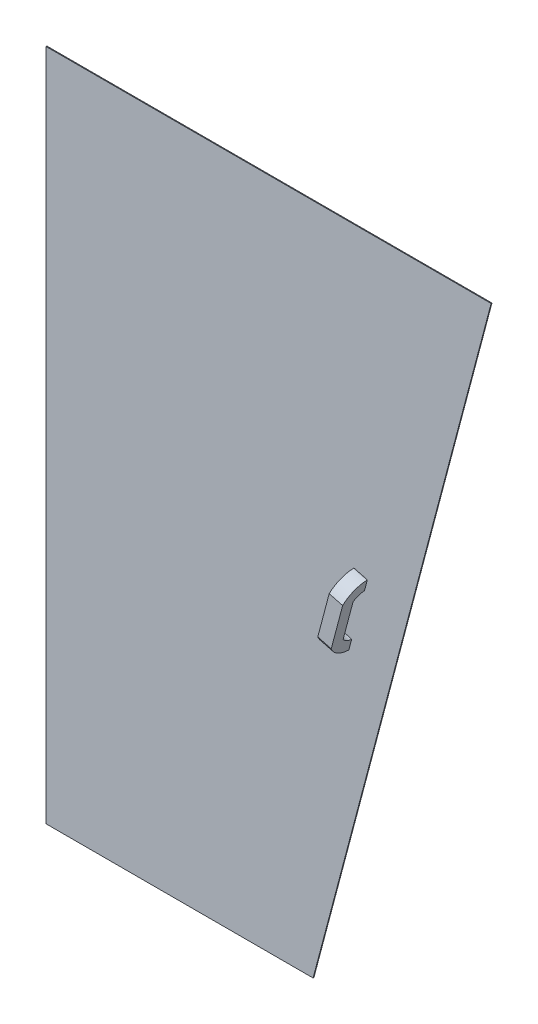
ISO-10303-21;
HEADER;
FILE_DESCRIPTION(('STEP AP214'),'2;1');
FILE_NAME('part.step','',(''),(''),'','','');
FILE_SCHEMA(('AUTOMOTIVE_DESIGN { 1 0 10303 214 1 1 1 1 }'));
ENDSEC;
DATA;
#1=APPLICATION_CONTEXT('core data for automotive mechanical design processes');
#2=APPLICATION_PROTOCOL_DEFINITION('international standard','automotive_design',2000,#1);
#3=PRODUCT_CONTEXT('',#1,'mechanical');
#4=PRODUCT('Part','Part','',(#3));
#5=PRODUCT_RELATED_PRODUCT_CATEGORY('part','',(#4));
#6=PRODUCT_DEFINITION_FORMATION('','',#4);
#7=PRODUCT_DEFINITION_CONTEXT('part definition',#1,'design');
#8=PRODUCT_DEFINITION('design','',#6,#7);
#9=PRODUCT_DEFINITION_SHAPE('','',#8);
#10=(LENGTH_UNIT() NAMED_UNIT(*) SI_UNIT(.MILLI.,.METRE.));
#11=(NAMED_UNIT(*) PLANE_ANGLE_UNIT() SI_UNIT($,.RADIAN.));
#12=(NAMED_UNIT(*) SI_UNIT($,.STERADIAN.) SOLID_ANGLE_UNIT());
#13=UNCERTAINTY_MEASURE_WITH_UNIT(LENGTH_MEASURE(1.E-05),#10,'distance_accuracy_value','');
#14=(GEOMETRIC_REPRESENTATION_CONTEXT(3) GLOBAL_UNCERTAINTY_ASSIGNED_CONTEXT((#13)) GLOBAL_UNIT_ASSIGNED_CONTEXT((#10,
#11,#12)) REPRESENTATION_CONTEXT('',''));
#15=CARTESIAN_POINT('',(0.,0.,0.));
#16=DIRECTION('',(0.,0.,1.));
#17=DIRECTION('',(1.,0.,0.));
#18=AXIS2_PLACEMENT_3D('',#15,#16,#17);
#19=CARTESIAN_POINT('',(116.663606292097,71.088047630501,955.148483057093));
#20=DIRECTION('',(0.,1.,0.));
#21=DIRECTION('',(0.,0.,1.));
#22=AXIS2_PLACEMENT_3D('',#19,#20,#21);
#23=PLANE('',#22);
#24=DIRECTION('',(1.,0.,0.));
#25=VECTOR('',#24,1.);
#26=CARTESIAN_POINT('',(116.663606292097,71.088047630501,953.648483057093));
#27=LINE('',#26,#25);
#28=CARTESIAN_POINT('',(116.663606292097,71.088047630501,953.648483057093));
#29=VERTEX_POINT('',#28);
#30=CARTESIAN_POINT('',(596.663606292097,71.088047630501,953.648483057093));
#31=VERTEX_POINT('',#30);
#32=EDGE_CURVE('P0_E79',#29,#31,#27,.T.);
#33=ORIENTED_EDGE('',*,*,#32,.T.);
#34=DIRECTION('',(0.,0.,-1.));
#35=VECTOR('',#34,1.);
#36=CARTESIAN_POINT('',(596.663606292097,71.088047630501,955.148483057093));
#37=LINE('',#36,#35);
#38=CARTESIAN_POINT('',(596.663606292097,71.088047630501,955.148483057093));
#39=VERTEX_POINT('',#38);
#40=EDGE_CURVE('P0_E11',#39,#31,#37,.T.);
#41=ORIENTED_EDGE('',*,*,#40,.F.);
#42=DIRECTION('',(1.,0.,0.));
#43=VECTOR('',#42,1.);
#44=CARTESIAN_POINT('',(116.663606292097,71.088047630501,955.148483057093));
#45=LINE('',#44,#43);
#46=CARTESIAN_POINT('',(116.663606292097,71.088047630501,955.148483057093));
#47=VERTEX_POINT('',#46);
#48=EDGE_CURVE('P0_E67',#47,#39,#45,.T.);
#49=ORIENTED_EDGE('',*,*,#48,.F.);
#50=DIRECTION('',(0.,0.,-1.));
#51=VECTOR('',#50,1.);
#52=CARTESIAN_POINT('',(116.663606292097,71.088047630501,955.148483057093));
#53=LINE('',#52,#51);
#54=EDGE_CURVE('P0_E75',#47,#29,#53,.T.);
#55=ORIENTED_EDGE('',*,*,#54,.T.);
#56=EDGE_LOOP('',(#33,#41,#49,#55));
#57=FACE_BOUND('',#56,.T.);
#58=ADVANCED_FACE('P0_F16',(#57),#23,.F.);
#59=CARTESIAN_POINT('',(596.663606292097,71.088047630501,955.148483057093));
#60=DIRECTION('',(-0.966763333893034,0.255672947806422,0.));
#61=DIRECTION('',(-0.255672947806422,-0.966763333893034,0.));
#62=AXIS2_PLACEMENT_3D('',#59,#60,#61);
#63=PLANE('',#62);
#64=DIRECTION('',(0.255672947806422,0.966763333893034,0.));
#65=VECTOR('',#64,1.);
#66=CARTESIAN_POINT('',(596.663606292097,71.088047630501,953.648483057093));
#67=LINE('',#66,#65);
#68=CARTESIAN_POINT('',(916.663606292097,1281.0880476305,953.648483057093));
#69=VERTEX_POINT('',#68);
#70=EDGE_CURVE('P0_E71',#31,#69,#67,.T.);
#71=ORIENTED_EDGE('',*,*,#70,.T.);
#72=DIRECTION('',(0.,0.,-1.));
#73=VECTOR('',#72,1.);
#74=CARTESIAN_POINT('',(916.663606292097,1281.0880476305,955.148483057093));
#75=LINE('',#74,#73);
#76=CARTESIAN_POINT('',(916.663606292097,1281.0880476305,955.148483057093));
#77=VERTEX_POINT('',#76);
#78=EDGE_CURVE('P0_E24',#77,#69,#75,.T.);
#79=ORIENTED_EDGE('',*,*,#78,.F.);
#80=DIRECTION('',(0.255672947806422,0.966763333893034,0.));
#81=VECTOR('',#80,1.);
#82=CARTESIAN_POINT('',(596.663606292097,71.088047630501,955.148483057093));
#83=LINE('',#82,#81);
#84=EDGE_CURVE('P0_E62',#39,#77,#83,.T.);
#85=ORIENTED_EDGE('',*,*,#84,.F.);
#86=ORIENTED_EDGE('',*,*,#40,.T.);
#87=EDGE_LOOP('',(#71,#79,#85,#86));
#88=FACE_BOUND('',#87,.T.);
#89=ADVANCED_FACE('P0_F70',(#88),#63,.F.);
#90=CARTESIAN_POINT('',(116.663606292097,1281.0880476305,955.148483057093));
#91=DIRECTION('',(0.,-1.,0.));
#92=DIRECTION('',(0.,0.,-1.));
#93=AXIS2_PLACEMENT_3D('',#90,#91,#92);
#94=PLANE('',#93);
#95=DIRECTION('',(-1.,0.,0.));
#96=VECTOR('',#95,1.);
#97=CARTESIAN_POINT('',(116.663606292097,1281.0880476305,953.648483057093));
#98=LINE('',#97,#96);
#99=CARTESIAN_POINT('',(116.663606292097,1281.0880476305,953.648483057093));
#100=VERTEX_POINT('',#99);
#101=EDGE_CURVE('P0_E49',#69,#100,#98,.T.);
#102=ORIENTED_EDGE('',*,*,#101,.T.);
#103=DIRECTION('',(0.,0.,-1.));
#104=VECTOR('',#103,1.);
#105=CARTESIAN_POINT('',(116.663606292097,1281.0880476305,955.148483057093));
#106=LINE('',#105,#104);
#107=CARTESIAN_POINT('',(116.663606292097,1281.0880476305,955.148483057093));
#108=VERTEX_POINT('',#107);
#109=EDGE_CURVE('P0_E72',#108,#100,#106,.T.);
#110=ORIENTED_EDGE('',*,*,#109,.F.);
#111=DIRECTION('',(-1.,0.,0.));
#112=VECTOR('',#111,1.);
#113=CARTESIAN_POINT('',(116.663606292097,1281.0880476305,955.148483057093));
#114=LINE('',#113,#112);
#115=EDGE_CURVE('P0_E65',#77,#108,#114,.T.);
#116=ORIENTED_EDGE('',*,*,#115,.F.);
#117=ORIENTED_EDGE('',*,*,#78,.T.);
#118=EDGE_LOOP('',(#102,#110,#116,#117));
#119=FACE_BOUND('',#118,.T.);
#120=ADVANCED_FACE('P0_F73',(#119),#94,.F.);
#121=CARTESIAN_POINT('',(116.663606292097,71.088047630501,955.148483057093));
#122=DIRECTION('',(1.,0.,0.));
#123=DIRECTION('',(0.,0.,-1.));
#124=AXIS2_PLACEMENT_3D('',#121,#122,#123);
#125=PLANE('',#124);
#126=DIRECTION('',(0.,-1.,0.));
#127=VECTOR('',#126,1.);
#128=CARTESIAN_POINT('',(116.663606292097,71.088047630501,953.648483057093));
#129=LINE('',#128,#127);
#130=EDGE_CURVE('P0_E55',#100,#29,#129,.T.);
#131=ORIENTED_EDGE('',*,*,#130,.T.);
#132=ORIENTED_EDGE('',*,*,#54,.F.);
#133=DIRECTION('',(0.,-1.,0.));
#134=VECTOR('',#133,1.);
#135=CARTESIAN_POINT('',(116.663606292097,71.088047630501,955.148483057093));
#136=LINE('',#135,#134);
#137=EDGE_CURVE('P0_E32',#108,#47,#136,.T.);
#138=ORIENTED_EDGE('',*,*,#137,.F.);
#139=ORIENTED_EDGE('',*,*,#109,.T.);
#140=EDGE_LOOP('',(#131,#132,#138,#139));
#141=FACE_BOUND('',#140,.T.);
#142=ADVANCED_FACE('P0_F86',(#141),#125,.F.);
#143=CARTESIAN_POINT('',(358.62164825014,667.102033644487,955.148483057093));
#144=DIRECTION('',(0.,0.,1.));
#145=DIRECTION('',(1.,0.,0.));
#146=AXIS2_PLACEMENT_3D('',#143,#144,#145);
#147=PLANE('',#146);
#148=ORIENTED_EDGE('',*,*,#48,.T.);
#149=ORIENTED_EDGE('',*,*,#84,.T.);
#150=ORIENTED_EDGE('',*,*,#115,.T.);
#151=ORIENTED_EDGE('',*,*,#137,.T.);
#152=EDGE_LOOP('',(#148,#149,#150,#151));
#153=FACE_BOUND('',#152,.T.);
#154=ADVANCED_FACE('P0_F63',(#153),#147,.T.);
#155=CARTESIAN_POINT('',(358.62164825014,667.102033644487,953.648483057093));
#156=DIRECTION('',(0.,0.,1.));
#157=DIRECTION('',(1.,0.,0.));
#158=AXIS2_PLACEMENT_3D('',#155,#156,#157);
#159=PLANE('',#158);
#160=ORIENTED_EDGE('',*,*,#32,.F.);
#161=ORIENTED_EDGE('',*,*,#130,.F.);
#162=ORIENTED_EDGE('',*,*,#101,.F.);
#163=ORIENTED_EDGE('',*,*,#70,.F.);
#164=EDGE_LOOP('',(#160,#161,#162,#163));
#165=FACE_BOUND('',#164,.T.);
#166=ADVANCED_FACE('P0_F89',(#165),#159,.F.);
#167=CLOSED_SHELL('',(#58,#89,#120,#142,#154,#166));
#168=MANIFOLD_SOLID_BREP('P0_B1',#167);
#169=CARTESIAN_POINT('',(637.249242032054,622.143716729709,955.620940496729));
#170=DIRECTION('',(0.966763333893034,-0.255672947806422,0.));
#171=DIRECTION('',(0.255672947806422,0.966763333893034,0.));
#172=AXIS2_PLACEMENT_3D('',#169,#170,#171);
#173=CYLINDRICAL_SURFACE('',#172,1.95791401243348);
#174=CARTESIAN_POINT('',(661.41832537938,615.751893034549,955.620940496729));
#175=DIRECTION('',(-0.966763333893034,0.255672947806422,0.));
#176=DIRECTION('',(-0.255672947806422,-0.966763333893034,0.));
#177=AXIS2_PLACEMENT_3D('',#174,#175,#176);
#178=CIRCLE('',#177,1.95791401243348);
#179=CARTESIAN_POINT('',(660.920498603075,613.869485536646,955.826215416577));
#180=VERTEX_POINT('',#179);
#181=CARTESIAN_POINT('',(660.932532565505,613.914988957085,955.148483057093));
#182=VERTEX_POINT('',#181);
#183=EDGE_CURVE('P1_E119',#180,#182,#178,.F.);
#184=ORIENTED_EDGE('',*,*,#183,.F.);
#185=DIRECTION('',(0.966763333893034,-0.255672947806422,0.));
#186=VECTOR('',#185,1.);
#187=CARTESIAN_POINT('',(636.751415255749,620.261309231807,955.826215416577));
#188=LINE('',#187,#186);
#189=CARTESIAN_POINT('',(636.751415255749,620.261309231807,955.826215416577));
#190=VERTEX_POINT('',#189);
#191=EDGE_CURVE('P1_E11',#190,#180,#188,.T.);
#192=ORIENTED_EDGE('',*,*,#191,.F.);
#193=CARTESIAN_POINT('',(637.249242032054,622.143716729709,955.620940496729));
#194=DIRECTION('',(-0.966763333893034,0.255672947806422,0.));
#195=DIRECTION('',(-0.255672947806422,-0.966763333893034,0.));
#196=AXIS2_PLACEMENT_3D('',#193,#194,#195);
#197=CIRCLE('',#196,1.95791401243348);
#198=CARTESIAN_POINT('',(636.763449218179,620.306812652245,955.148483057093));
#199=VERTEX_POINT('',#198);
#200=EDGE_CURVE('P1_E143',#190,#199,#197,.F.);
#201=ORIENTED_EDGE('',*,*,#200,.T.);
#202=DIRECTION('',(0.966763333893034,-0.255672947806422,0.));
#203=VECTOR('',#202,1.);
#204=CARTESIAN_POINT('',(636.763449218179,620.306812652245,955.148483057093));
#205=LINE('',#204,#203);
#206=EDGE_CURVE('P1_E73',#199,#182,#205,.T.);
#207=ORIENTED_EDGE('',*,*,#206,.T.);
#208=EDGE_LOOP('',(#184,#192,#201,#207));
#209=FACE_BOUND('',#208,.T.);
#210=ADVANCED_FACE('P1_F16',(#209),#173,.T.);
#211=CARTESIAN_POINT('',(648.264119836742,663.793723428685,952.767419476116));
#212=DIRECTION('',(0.966763333893034,-0.255672947806422,0.));
#213=DIRECTION('',(0.255672947806422,0.966763333893034,0.));
#214=AXIS2_PLACEMENT_3D('',#211,#212,#213);
#215=CYLINDRICAL_SURFACE('',#214,45.1328005466438);
#216=CARTESIAN_POINT('',(672.433203184068,657.401899733524,952.767419476116));
#217=DIRECTION('',(-0.966763333893034,0.255672947806422,0.));
#218=DIRECTION('',(-0.255672947806422,-0.966763333893034,0.));
#219=AXIS2_PLACEMENT_3D('',#216,#217,#218);
#220=CIRCLE('',#219,45.1328005466438);
#221=CARTESIAN_POINT('',(667.279383255819,637.914018129833,993.148483057093));
#222=VERTEX_POINT('',#221);
#223=EDGE_CURVE('P1_E122',#222,#180,#220,.F.);
#224=ORIENTED_EDGE('',*,*,#223,.F.);
#225=DIRECTION('',(0.966763333893034,-0.255672947806422,0.));
#226=VECTOR('',#225,1.);
#227=CARTESIAN_POINT('',(643.110299908493,644.305841824994,993.148483057093));
#228=LINE('',#227,#226);
#229=CARTESIAN_POINT('',(643.110299908493,644.305841824994,993.148483057093));
#230=VERTEX_POINT('',#229);
#231=EDGE_CURVE('P1_E24',#230,#222,#228,.T.);
#232=ORIENTED_EDGE('',*,*,#231,.F.);
#233=CARTESIAN_POINT('',(648.264119836742,663.793723428685,952.767419476116));
#234=DIRECTION('',(-0.966763333893034,0.255672947806422,0.));
#235=DIRECTION('',(-0.255672947806422,-0.966763333893034,0.));
#236=AXIS2_PLACEMENT_3D('',#233,#234,#235);
#237=CIRCLE('',#236,45.1328005466438);
#238=EDGE_CURVE('P1_E195',#230,#190,#237,.F.);
#239=ORIENTED_EDGE('',*,*,#238,.T.);
#240=ORIENTED_EDGE('',*,*,#191,.T.);
#241=EDGE_LOOP('',(#224,#232,#239,#240));
#242=FACE_BOUND('',#241,.T.);
#243=ADVANCED_FACE('P1_F166',(#242),#215,.T.);
#244=CARTESIAN_POINT('',(653.364278305398,683.078697638291,993.148483057093));
#245=DIRECTION('',(0.,0.,1.));
#246=DIRECTION('',(-0.966763333893034,0.255672947806422,0.));
#247=AXIS2_PLACEMENT_3D('',#244,#245,#246);
#248=PLANE('',#247);
#249=DIRECTION('',(-0.255672947806422,-0.966763333893034,0.));
#250=VECTOR('',#249,1.);
#251=CARTESIAN_POINT('',(677.533361652724,676.686873943131,993.148483057093));
#252=LINE('',#251,#250);
#253=CARTESIAN_POINT('',(687.787340049629,715.459729756429,993.148483057093));
#254=VERTEX_POINT('',#253);
#255=EDGE_CURVE('P1_E126',#254,#222,#252,.T.);
#256=ORIENTED_EDGE('',*,*,#255,.F.);
#257=DIRECTION('',(0.966763333893034,-0.255672947806422,0.));
#258=VECTOR('',#257,1.);
#259=CARTESIAN_POINT('',(663.618256702303,721.851553451589,993.148483057093));
#260=LINE('',#259,#258);
#261=CARTESIAN_POINT('',(663.618256702303,721.851553451589,993.148483057093));
#262=VERTEX_POINT('',#261);
#263=EDGE_CURVE('P1_E155',#262,#254,#260,.T.);
#264=ORIENTED_EDGE('',*,*,#263,.F.);
#265=DIRECTION('',(-0.255672947806422,-0.966763333893034,0.));
#266=VECTOR('',#265,1.);
#267=CARTESIAN_POINT('',(653.364278305398,683.078697638291,993.148483057093));
#268=LINE('',#267,#266);
#269=EDGE_CURVE('P1_E162',#262,#230,#268,.T.);
#270=ORIENTED_EDGE('',*,*,#269,.T.);
#271=ORIENTED_EDGE('',*,*,#231,.T.);
#272=EDGE_LOOP('',(#256,#264,#270,#271));
#273=FACE_BOUND('',#272,.T.);
#274=ADVANCED_FACE('P1_F160',(#273),#248,.T.);
#275=CARTESIAN_POINT('',(658.464436774054,702.363671847898,952.767419476116));
#276=DIRECTION('',(0.966763333893034,-0.255672947806422,0.));
#277=DIRECTION('',(0.255672947806422,0.966763333893034,0.));
#278=AXIS2_PLACEMENT_3D('',#275,#276,#277);
#279=CYLINDRICAL_SURFACE('',#278,45.1328005466438);
#280=CARTESIAN_POINT('',(682.63352012138,695.971848152738,952.767419476116));
#281=DIRECTION('',(-0.966763333893034,0.255672947806422,0.));
#282=DIRECTION('',(-0.255672947806422,-0.966763333893034,0.));
#283=AXIS2_PLACEMENT_3D('',#280,#281,#282);
#284=CIRCLE('',#283,45.1328005466438);
#285=CARTESIAN_POINT('',(694.146224702373,739.504262349616,955.826215416577));
#286=VERTEX_POINT('',#285);
#287=EDGE_CURVE('P1_E129',#254,#286,#284,.T.);
#288=ORIENTED_EDGE('',*,*,#287,.T.);
#289=DIRECTION('',(0.966763333893034,-0.255672947806422,0.));
#290=VECTOR('',#289,1.);
#291=CARTESIAN_POINT('',(669.977141355047,745.896086044776,955.826215416577));
#292=LINE('',#291,#290);
#293=CARTESIAN_POINT('',(669.977141355047,745.896086044776,955.826215416577));
#294=VERTEX_POINT('',#293);
#295=EDGE_CURVE('P1_E152',#294,#286,#292,.T.);
#296=ORIENTED_EDGE('',*,*,#295,.F.);
#297=CARTESIAN_POINT('',(658.464436774054,702.363671847898,952.767419476116));
#298=DIRECTION('',(-0.966763333893034,0.255672947806422,0.));
#299=DIRECTION('',(-0.255672947806422,-0.966763333893034,0.));
#300=AXIS2_PLACEMENT_3D('',#297,#298,#299);
#301=CIRCLE('',#300,45.1328005466438);
#302=EDGE_CURVE('P1_E183',#262,#294,#301,.T.);
#303=ORIENTED_EDGE('',*,*,#302,.F.);
#304=ORIENTED_EDGE('',*,*,#263,.T.);
#305=EDGE_LOOP('',(#288,#296,#303,#304));
#306=FACE_BOUND('',#305,.T.);
#307=ADVANCED_FACE('P1_F174',(#306),#279,.T.);
#308=CARTESIAN_POINT('',(666.069727770349,731.121178427636,953.528586121945));
#309=DIRECTION('',(0.966763333893034,-0.255672947806422,0.));
#310=DIRECTION('',(0.255672947806422,0.966763333893034,0.));
#311=AXIS2_PLACEMENT_3D('',#308,#309,#310);
#312=CYLINDRICAL_SURFACE('',#311,15.4546069633774);
#313=CARTESIAN_POINT('',(690.238811117674,724.729354732475,953.528586121945));
#314=DIRECTION('',(-0.966763333893034,0.255672947806422,0.));
#315=DIRECTION('',(-0.255672947806422,-0.966763333893034,0.));
#316=AXIS2_PLACEMENT_3D('',#313,#314,#315);
#317=CIRCLE('',#316,15.4546069633774);
#318=CARTESIAN_POINT('',(694.168370500865,739.588001150166,955.148483057093));
#319=VERTEX_POINT('',#318);
#320=EDGE_CURVE('P1_E131',#286,#319,#317,.T.);
#321=ORIENTED_EDGE('',*,*,#320,.T.);
#322=DIRECTION('',(0.966763333893034,-0.255672947806422,0.));
#323=VECTOR('',#322,1.);
#324=CARTESIAN_POINT('',(669.99928715354,745.979824845326,955.148483057093));
#325=LINE('',#324,#323);
#326=CARTESIAN_POINT('',(669.99928715354,745.979824845326,955.148483057093));
#327=VERTEX_POINT('',#326);
#328=EDGE_CURVE('P1_E149',#327,#319,#325,.T.);
#329=ORIENTED_EDGE('',*,*,#328,.F.);
#330=CARTESIAN_POINT('',(666.069727770349,731.121178427636,953.528586121945));
#331=DIRECTION('',(-0.966763333893034,0.255672947806422,0.));
#332=DIRECTION('',(-0.255672947806422,-0.966763333893034,0.));
#333=AXIS2_PLACEMENT_3D('',#330,#331,#332);
#334=CIRCLE('',#333,15.4546069633774);
#335=EDGE_CURVE('P1_E180',#294,#327,#334,.T.);
#336=ORIENTED_EDGE('',*,*,#335,.F.);
#337=ORIENTED_EDGE('',*,*,#295,.T.);
#338=EDGE_LOOP('',(#321,#329,#336,#337));
#339=FACE_BOUND('',#338,.T.);
#340=ADVANCED_FACE('P1_F178',(#339),#312,.T.);
#341=CARTESIAN_POINT('',(653.364278305398,683.078697638291,955.148483057093));
#342=DIRECTION('',(0.,0.,1.));
#343=DIRECTION('',(-0.966763333893034,0.255672947806422,0.));
#344=AXIS2_PLACEMENT_3D('',#341,#342,#343);
#345=PLANE('',#344);
#346=CARTESIAN_POINT('',(679.510832108414,733.054769154828,955.148483057093));
#347=DIRECTION('',(0.,0.,-1.));
#348=DIRECTION('',(0.966763333893034,-0.255672947806422,0.));
#349=AXIS2_PLACEMENT_3D('',#346,#347,#348);
#350=CIRCLE('',#349,2.);
#351=CARTESIAN_POINT('',(681.4443587762,732.543423259215,955.148483057093));
#352=VERTEX_POINT('',#351);
#353=EDGE_CURVE('P1_E205',#352,#352,#350,.T.);
#354=ORIENTED_EDGE('',*,*,#353,.F.);
#355=EDGE_LOOP('',(#354));
#356=FACE_BOUND('',#355,.T.);
#357=DIRECTION('',(-0.255672947806422,-0.966763333893034,0.));
#358=VECTOR('',#357,1.);
#359=CARTESIAN_POINT('',(677.533361652724,676.686873943131,955.148483057093));
#360=LINE('',#359,#358);
#361=CARTESIAN_POINT('',(689.030394938515,720.160031055028,955.148483057093));
#362=VERTEX_POINT('',#361);
#363=EDGE_CURVE('P1_E133',#319,#362,#360,.T.);
#364=ORIENTED_EDGE('',*,*,#363,.T.);
#365=DIRECTION('',(0.966763333893034,-0.255672947806422,0.));
#366=VECTOR('',#365,1.);
#367=CARTESIAN_POINT('',(664.861311591189,726.551854750188,955.148483057093));
#368=LINE('',#367,#366);
#369=CARTESIAN_POINT('',(664.861311591189,726.551854750188,955.148483057093));
#370=VERTEX_POINT('',#369);
#371=EDGE_CURVE('P1_E147',#370,#362,#368,.T.);
#372=ORIENTED_EDGE('',*,*,#371,.F.);
#373=DIRECTION('',(-0.255672947806422,-0.966763333893034,0.));
#374=VECTOR('',#373,1.);
#375=CARTESIAN_POINT('',(653.364278305398,683.078697638291,955.148483057093));
#376=LINE('',#375,#374);
#377=EDGE_CURVE('P1_E182',#327,#370,#376,.T.);
#378=ORIENTED_EDGE('',*,*,#377,.F.);
#379=ORIENTED_EDGE('',*,*,#328,.T.);
#380=EDGE_LOOP('',(#364,#372,#378,#379));
#381=FACE_BOUND('',#380,.T.);
#382=ADVANCED_FACE('P1_F220',(#356,#381),#345,.F.);
#383=CARTESIAN_POINT('',(658.464436774054,702.363671847898,952.767419476116));
#384=DIRECTION('',(0.966763333893034,-0.255672947806422,0.));
#385=DIRECTION('',(0.255672947806422,0.966763333893034,0.));
#386=AXIS2_PLACEMENT_3D('',#383,#384,#385);
#387=CYLINDRICAL_SURFACE('',#386,25.1328005466438);
#388=CARTESIAN_POINT('',(682.63352012138,695.971848152738,952.767419476116));
#389=DIRECTION('',(-0.966763333893034,0.255672947806422,0.));
#390=DIRECTION('',(-0.255672947806422,-0.966763333893034,0.));
#391=AXIS2_PLACEMENT_3D('',#388,#389,#390);
#392=CIRCLE('',#391,25.1328005466438);
#393=CARTESIAN_POINT('',(686.393476695963,710.189183950377,973.148483057093));
#394=VERTEX_POINT('',#393);
#395=EDGE_CURVE('P1_E136',#394,#362,#392,.T.);
#396=ORIENTED_EDGE('',*,*,#395,.F.);
#397=DIRECTION('',(0.966763333893034,-0.255672947806422,0.));
#398=VECTOR('',#397,1.);
#399=CARTESIAN_POINT('',(662.224393348637,716.581007645538,973.148483057093));
#400=LINE('',#399,#398);
#401=CARTESIAN_POINT('',(662.224393348637,716.581007645538,973.148483057093));
#402=VERTEX_POINT('',#401);
#403=EDGE_CURVE('P1_E111',#402,#394,#400,.T.);
#404=ORIENTED_EDGE('',*,*,#403,.F.);
#405=CARTESIAN_POINT('',(658.464436774054,702.363671847898,952.767419476116));
#406=DIRECTION('',(-0.966763333893034,0.255672947806422,0.));
#407=DIRECTION('',(-0.255672947806422,-0.966763333893034,0.));
#408=AXIS2_PLACEMENT_3D('',#405,#406,#407);
#409=CIRCLE('',#408,25.1328005466438);
#410=EDGE_CURVE('P1_E104',#402,#370,#409,.T.);
#411=ORIENTED_EDGE('',*,*,#410,.T.);
#412=ORIENTED_EDGE('',*,*,#371,.T.);
#413=EDGE_LOOP('',(#396,#404,#411,#412));
#414=FACE_BOUND('',#413,.T.);
#415=ADVANCED_FACE('P1_F190',(#414),#387,.F.);
#416=CARTESIAN_POINT('',(653.364278305398,683.078697638291,973.148483057093));
#417=DIRECTION('',(0.,0.,1.));
#418=DIRECTION('',(-0.966763333893034,0.255672947806422,0.));
#419=AXIS2_PLACEMENT_3D('',#416,#417,#418);
#420=PLANE('',#419);
#421=DIRECTION('',(-0.255672947806422,-0.966763333893034,0.));
#422=VECTOR('',#421,1.);
#423=CARTESIAN_POINT('',(677.533361652724,676.686873943131,973.148483057093));
#424=LINE('',#423,#422);
#425=CARTESIAN_POINT('',(668.673246609485,643.184563935885,973.148483057093));
#426=VERTEX_POINT('',#425);
#427=EDGE_CURVE('P1_E110',#394,#426,#424,.T.);
#428=ORIENTED_EDGE('',*,*,#427,.T.);
#429=DIRECTION('',(0.966763333893034,-0.255672947806422,0.));
#430=VECTOR('',#429,1.);
#431=CARTESIAN_POINT('',(644.504163262159,649.576387631045,973.148483057093));
#432=LINE('',#431,#430);
#433=CARTESIAN_POINT('',(644.504163262159,649.576387631045,973.148483057093));
#434=VERTEX_POINT('',#433);
#435=EDGE_CURVE('P1_E107',#434,#426,#432,.T.);
#436=ORIENTED_EDGE('',*,*,#435,.F.);
#437=DIRECTION('',(-0.255672947806422,-0.966763333893034,0.));
#438=VECTOR('',#437,1.);
#439=CARTESIAN_POINT('',(653.364278305398,683.078697638291,973.148483057093));
#440=LINE('',#439,#438);
#441=EDGE_CURVE('P1_E98',#402,#434,#440,.T.);
#442=ORIENTED_EDGE('',*,*,#441,.F.);
#443=ORIENTED_EDGE('',*,*,#403,.T.);
#444=EDGE_LOOP('',(#428,#436,#442,#443));
#445=FACE_BOUND('',#444,.T.);
#446=ADVANCED_FACE('P1_F108',(#445),#420,.F.);
#447=CARTESIAN_POINT('',(648.264119836742,663.793723428685,952.767419476116));
#448=DIRECTION('',(0.966763333893034,-0.255672947806422,0.));
#449=DIRECTION('',(0.255672947806422,0.966763333893034,0.));
#450=AXIS2_PLACEMENT_3D('',#447,#448,#449);
#451=CYLINDRICAL_SURFACE('',#450,25.1328005466438);
#452=CARTESIAN_POINT('',(672.433203184068,657.401899733524,952.767419476116));
#453=DIRECTION('',(-0.966763333893034,0.255672947806422,0.));
#454=DIRECTION('',(-0.255672947806422,-0.966763333893034,0.));
#455=AXIS2_PLACEMENT_3D('',#452,#453,#454);
#456=CIRCLE('',#455,25.1328005466438);
#457=CARTESIAN_POINT('',(666.036328366933,633.213716831234,955.148483057093));
#458=VERTEX_POINT('',#457);
#459=EDGE_CURVE('P1_E66',#426,#458,#456,.F.);
#460=ORIENTED_EDGE('',*,*,#459,.T.);
#461=DIRECTION('',(0.966763333893034,-0.255672947806422,0.));
#462=VECTOR('',#461,1.);
#463=CARTESIAN_POINT('',(641.867245019607,639.605540526395,955.148483057093));
#464=LINE('',#463,#462);
#465=CARTESIAN_POINT('',(641.867245019607,639.605540526395,955.148483057093));
#466=VERTEX_POINT('',#465);
#467=EDGE_CURVE('P1_E112',#466,#458,#464,.T.);
#468=ORIENTED_EDGE('',*,*,#467,.F.);
#469=CARTESIAN_POINT('',(648.264119836742,663.793723428685,952.767419476116));
#470=DIRECTION('',(-0.966763333893034,0.255672947806422,0.));
#471=DIRECTION('',(-0.255672947806422,-0.966763333893034,0.));
#472=AXIS2_PLACEMENT_3D('',#469,#470,#471);
#473=CIRCLE('',#472,25.1328005466438);
#474=EDGE_CURVE('P1_E102',#434,#466,#473,.F.);
#475=ORIENTED_EDGE('',*,*,#474,.F.);
#476=ORIENTED_EDGE('',*,*,#435,.T.);
#477=EDGE_LOOP('',(#460,#468,#475,#476));
#478=FACE_BOUND('',#477,.T.);
#479=ADVANCED_FACE('P1_F114',(#478),#451,.F.);
#480=CARTESIAN_POINT('',(653.364278305398,683.078697638291,955.148483057093));
#481=DIRECTION('',(0.,0.,1.));
#482=DIRECTION('',(-0.966763333893034,0.255672947806422,0.));
#483=AXIS2_PLACEMENT_3D('',#480,#481,#482);
#484=PLANE('',#483);
#485=CARTESIAN_POINT('',(651.386807849708,626.710802426594,955.148483057093));
#486=DIRECTION('',(0.,0.,-1.));
#487=DIRECTION('',(-0.966763333893034,0.255672947806422,0.));
#488=AXIS2_PLACEMENT_3D('',#485,#486,#487);
#489=CIRCLE('',#488,2.);
#490=CARTESIAN_POINT('',(649.453281181922,627.222148322207,955.148483057093));
#491=VERTEX_POINT('',#490);
#492=EDGE_CURVE('P1_E199',#491,#491,#489,.T.);
#493=ORIENTED_EDGE('',*,*,#492,.F.);
#494=EDGE_LOOP('',(#493));
#495=FACE_BOUND('',#494,.T.);
#496=DIRECTION('',(-0.255672947806422,-0.966763333893034,0.));
#497=VECTOR('',#496,1.);
#498=CARTESIAN_POINT('',(677.533361652724,676.686873943131,955.148483057093));
#499=LINE('',#498,#497);
#500=EDGE_CURVE('P1_E141',#458,#182,#499,.T.);
#501=ORIENTED_EDGE('',*,*,#500,.T.);
#502=ORIENTED_EDGE('',*,*,#206,.F.);
#503=DIRECTION('',(-0.255672947806422,-0.966763333893034,0.));
#504=VECTOR('',#503,1.);
#505=CARTESIAN_POINT('',(653.364278305398,683.078697638291,955.148483057093));
#506=LINE('',#505,#504);
#507=EDGE_CURVE('P1_E32',#466,#199,#506,.T.);
#508=ORIENTED_EDGE('',*,*,#507,.F.);
#509=ORIENTED_EDGE('',*,*,#467,.T.);
#510=EDGE_LOOP('',(#501,#502,#508,#509));
#511=FACE_BOUND('',#510,.T.);
#512=ADVANCED_FACE('P1_F194',(#495,#511),#484,.F.);
#513=CARTESIAN_POINT('',(653.364278305398,683.078697638291,955.148483057093));
#514=DIRECTION('',(-0.966763333893034,0.255672947806422,0.));
#515=DIRECTION('',(-0.255672947806422,-0.966763333893034,0.));
#516=AXIS2_PLACEMENT_3D('',#513,#514,#515);
#517=PLANE('',#516);
#518=ORIENTED_EDGE('',*,*,#200,.F.);
#519=ORIENTED_EDGE('',*,*,#238,.F.);
#520=ORIENTED_EDGE('',*,*,#269,.F.);
#521=ORIENTED_EDGE('',*,*,#302,.T.);
#522=ORIENTED_EDGE('',*,*,#335,.T.);
#523=ORIENTED_EDGE('',*,*,#377,.T.);
#524=ORIENTED_EDGE('',*,*,#410,.F.);
#525=ORIENTED_EDGE('',*,*,#441,.T.);
#526=ORIENTED_EDGE('',*,*,#474,.T.);
#527=ORIENTED_EDGE('',*,*,#507,.T.);
#528=EDGE_LOOP('',(#518,#519,#520,#521,#522,#523,#524,#525,#526,#527));
#529=FACE_BOUND('',#528,.T.);
#530=ADVANCED_FACE('P1_F100',(#529),#517,.T.);
#531=CARTESIAN_POINT('',(677.533361652724,676.686873943131,955.148483057093));
#532=DIRECTION('',(-0.966763333893034,0.255672947806422,0.));
#533=DIRECTION('',(-0.255672947806422,-0.966763333893034,0.));
#534=AXIS2_PLACEMENT_3D('',#531,#532,#533);
#535=PLANE('',#534);
#536=ORIENTED_EDGE('',*,*,#183,.T.);
#537=ORIENTED_EDGE('',*,*,#500,.F.);
#538=ORIENTED_EDGE('',*,*,#459,.F.);
#539=ORIENTED_EDGE('',*,*,#427,.F.);
#540=ORIENTED_EDGE('',*,*,#395,.T.);
#541=ORIENTED_EDGE('',*,*,#363,.F.);
#542=ORIENTED_EDGE('',*,*,#320,.F.);
#543=ORIENTED_EDGE('',*,*,#287,.F.);
#544=ORIENTED_EDGE('',*,*,#255,.T.);
#545=ORIENTED_EDGE('',*,*,#223,.T.);
#546=EDGE_LOOP('',(#536,#537,#538,#539,#540,#541,#542,#543,#544,#545));
#547=FACE_BOUND('',#546,.T.);
#548=ADVANCED_FACE('P1_F169',(#547),#535,.F.);
#549=CARTESIAN_POINT('',(651.386807849708,626.710802426594,965.148483057093));
#550=DIRECTION('',(0.,0.,-1.));
#551=DIRECTION('',(0.966763333893034,-0.255672947806422,0.));
#552=AXIS2_PLACEMENT_3D('',#549,#550,#551);
#553=CYLINDRICAL_SURFACE('',#552,2.);
#554=CARTESIAN_POINT('',(651.386807849708,626.710802426594,965.148483057093));
#555=DIRECTION('',(0.,0.,-1.));
#556=DIRECTION('',(-0.966763333893034,0.255672947806422,0.));
#557=AXIS2_PLACEMENT_3D('',#554,#555,#556);
#558=CIRCLE('',#557,2.);
#559=CARTESIAN_POINT('',(649.453281181922,627.222148322207,965.148483057093));
#560=VERTEX_POINT('',#559);
#561=EDGE_CURVE('P1_E202',#560,#560,#558,.T.);
#562=ORIENTED_EDGE('',*,*,#561,.F.);
#563=EDGE_LOOP('',(#562));
#564=FACE_BOUND('',#563,.T.);
#565=ORIENTED_EDGE('',*,*,#492,.T.);
#566=EDGE_LOOP('',(#565));
#567=FACE_BOUND('',#566,.T.);
#568=ADVANCED_FACE('P1_F306',(#564,#567),#553,.F.);
#569=CARTESIAN_POINT('',(651.386807849708,626.710802426594,965.148483057093));
#570=DIRECTION('',(0.,0.,1.));
#571=DIRECTION('',(-0.966763333893034,0.255672947806422,0.));
#572=AXIS2_PLACEMENT_3D('',#569,#570,#571);
#573=PLANE('',#572);
#574=ORIENTED_EDGE('',*,*,#561,.T.);
#575=EDGE_LOOP('',(#574));
#576=FACE_BOUND('',#575,.T.);
#577=ADVANCED_FACE('P1_F216',(#576),#573,.F.);
#578=CARTESIAN_POINT('',(679.510832108414,733.054769154828,965.148483057093));
#579=DIRECTION('',(0.,0.,-1.));
#580=DIRECTION('',(0.966763333893034,-0.255672947806422,0.));
#581=AXIS2_PLACEMENT_3D('',#578,#579,#580);
#582=CYLINDRICAL_SURFACE('',#581,2.);
#583=CARTESIAN_POINT('',(679.510832108414,733.054769154828,965.148483057093));
#584=DIRECTION('',(0.,0.,-1.));
#585=DIRECTION('',(0.966763333893034,-0.255672947806422,0.));
#586=AXIS2_PLACEMENT_3D('',#583,#584,#585);
#587=CIRCLE('',#586,2.);
#588=CARTESIAN_POINT('',(681.4443587762,732.543423259215,965.148483057093));
#589=VERTEX_POINT('',#588);
#590=EDGE_CURVE('P1_E123',#589,#589,#587,.T.);
#591=ORIENTED_EDGE('',*,*,#590,.F.);
#592=EDGE_LOOP('',(#591));
#593=FACE_BOUND('',#592,.T.);
#594=ORIENTED_EDGE('',*,*,#353,.T.);
#595=EDGE_LOOP('',(#594));
#596=FACE_BOUND('',#595,.T.);
#597=ADVANCED_FACE('P1_F213',(#593,#596),#582,.F.);
#598=CARTESIAN_POINT('',(679.510832108414,733.054769154828,965.148483057093));
#599=DIRECTION('',(0.,0.,-1.));
#600=DIRECTION('',(0.966763333893034,-0.255672947806422,0.));
#601=AXIS2_PLACEMENT_3D('',#598,#599,#600);
#602=PLANE('',#601);
#603=ORIENTED_EDGE('',*,*,#590,.T.);
#604=EDGE_LOOP('',(#603));
#605=FACE_BOUND('',#604,.T.);
#606=ADVANCED_FACE('P1_F211',(#605),#602,.T.);
#607=CLOSED_SHELL('',(#210,#243,#274,#307,#340,#382,#415,#446,#479,#512,#530,#548,#568,#577,
#597,#606));
#608=MANIFOLD_SOLID_BREP('P1_B1',#607);
#609=ADVANCED_BREP_SHAPE_REPRESENTATION('',(#18,#168,#608),#14);
#610=SHAPE_DEFINITION_REPRESENTATION(#9,#609);
ENDSEC;
END-ISO-10303-21;
